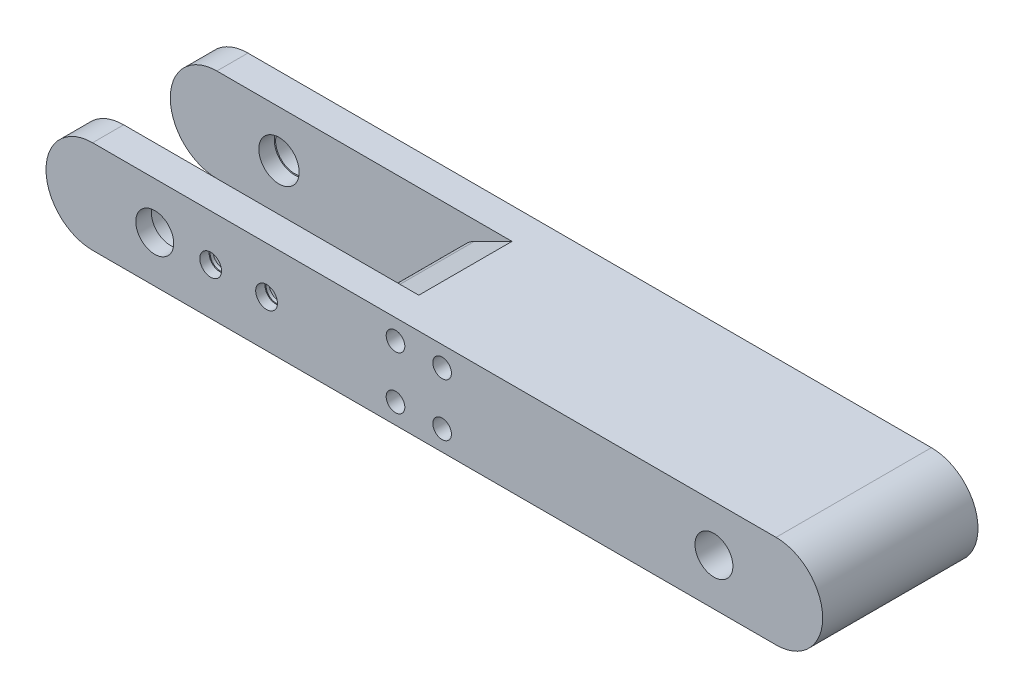
ISO-10303-21;
HEADER;
FILE_DESCRIPTION(('STEP AP214'),'2;1');
FILE_NAME('part.step','',(''),(''),'','','');
FILE_SCHEMA(('AUTOMOTIVE_DESIGN { 1 0 10303 214 1 1 1 1 }'));
ENDSEC;
DATA;
#1=APPLICATION_CONTEXT('core data for automotive mechanical design processes');
#2=APPLICATION_PROTOCOL_DEFINITION('international standard','automotive_design',2000,#1);
#3=PRODUCT_CONTEXT('',#1,'mechanical');
#4=PRODUCT('Part','Part','',(#3));
#5=PRODUCT_RELATED_PRODUCT_CATEGORY('part','',(#4));
#6=PRODUCT_DEFINITION_FORMATION('','',#4);
#7=PRODUCT_DEFINITION_CONTEXT('part definition',#1,'design');
#8=PRODUCT_DEFINITION('design','',#6,#7);
#9=PRODUCT_DEFINITION_SHAPE('','',#8);
#10=(LENGTH_UNIT() NAMED_UNIT(*) SI_UNIT(.MILLI.,.METRE.));
#11=(NAMED_UNIT(*) PLANE_ANGLE_UNIT() SI_UNIT($,.RADIAN.));
#12=(NAMED_UNIT(*) SI_UNIT($,.STERADIAN.) SOLID_ANGLE_UNIT());
#13=UNCERTAINTY_MEASURE_WITH_UNIT(LENGTH_MEASURE(1.E-05),#10,'distance_accuracy_value','');
#14=(GEOMETRIC_REPRESENTATION_CONTEXT(3) GLOBAL_UNCERTAINTY_ASSIGNED_CONTEXT((#13)) GLOBAL_UNIT_ASSIGNED_CONTEXT((#10,
#11,#12)) REPRESENTATION_CONTEXT('',''));
#15=CARTESIAN_POINT('',(0.,0.,0.));
#16=DIRECTION('',(0.,0.,1.));
#17=DIRECTION('',(1.,0.,0.));
#18=AXIS2_PLACEMENT_3D('',#15,#16,#17);
#19=CARTESIAN_POINT('',(-90.,0.,25.));
#20=DIRECTION('',(0.,0.,-1.));
#21=DIRECTION('',(-1.,0.,0.));
#22=AXIS2_PLACEMENT_3D('',#19,#20,#21);
#23=CYLINDRICAL_SURFACE('',#22,6.1);
#24=CARTESIAN_POINT('',(-90.,0.,-25.));
#25=DIRECTION('',(0.,0.,1.));
#26=DIRECTION('',(1.,0.,0.));
#27=AXIS2_PLACEMENT_3D('',#24,#25,#26);
#28=CIRCLE('',#27,6.1);
#29=CARTESIAN_POINT('',(-83.9,0.,-25.));
#30=VERTEX_POINT('',#29);
#31=EDGE_CURVE('E153',#30,#30,#28,.T.);
#32=ORIENTED_EDGE('',*,*,#31,.F.);
#33=EDGE_LOOP('',(#32));
#34=FACE_BOUND('',#33,.T.);
#35=CARTESIAN_POINT('',(-90.,0.,-20.));
#36=DIRECTION('',(0.,0.,1.));
#37=DIRECTION('',(1.,0.,0.));
#38=AXIS2_PLACEMENT_3D('',#35,#36,#37);
#39=CIRCLE('',#38,6.1);
#40=CARTESIAN_POINT('',(-83.9,0.,-20.));
#41=VERTEX_POINT('',#40);
#42=EDGE_CURVE('E37',#41,#41,#39,.T.);
#43=ORIENTED_EDGE('',*,*,#42,.T.);
#44=EDGE_LOOP('',(#43));
#45=FACE_BOUND('',#44,.T.);
#46=ADVANCED_FACE('F33',(#34,#45),#23,.F.);
#47=CARTESIAN_POINT('',(-90.,0.,25.));
#48=DIRECTION('',(0.,0.,1.));
#49=DIRECTION('',(1.,0.,0.));
#50=AXIS2_PLACEMENT_3D('',#47,#48,#49);
#51=CIRCLE('',#50,6.1);
#52=CARTESIAN_POINT('',(-83.9,0.,25.));
#53=VERTEX_POINT('',#52);
#54=EDGE_CURVE('E156',#53,#53,#51,.T.);
#55=ORIENTED_EDGE('',*,*,#54,.T.);
#56=EDGE_LOOP('',(#55));
#57=FACE_BOUND('',#56,.T.);
#58=CARTESIAN_POINT('',(-90.,0.,20.));
#59=DIRECTION('',(0.,0.,-1.));
#60=DIRECTION('',(-1.,0.,0.));
#61=AXIS2_PLACEMENT_3D('',#58,#59,#60);
#62=CIRCLE('',#61,6.1);
#63=CARTESIAN_POINT('',(-96.1,0.,20.));
#64=VERTEX_POINT('',#63);
#65=EDGE_CURVE('E206',#64,#64,#62,.T.);
#66=ORIENTED_EDGE('',*,*,#65,.T.);
#67=EDGE_LOOP('',(#66));
#68=FACE_BOUND('',#67,.T.);
#69=ADVANCED_FACE('F300',(#57,#68),#23,.F.);
#70=CARTESIAN_POINT('',(-110.,-15.,25.));
#71=DIRECTION('',(0.,1.,0.));
#72=DIRECTION('',(0.,0.,1.));
#73=AXIS2_PLACEMENT_3D('',#70,#71,#72);
#74=PLANE('',#73);
#75=DIRECTION('',(0.,0.,1.));
#76=VECTOR('',#75,1.);
#77=CARTESIAN_POINT('',(-15.,-15.,-15.));
#78=LINE('',#77,#76);
#79=CARTESIAN_POINT('',(-15.,-15.,-15.));
#80=VERTEX_POINT('',#79);
#81=CARTESIAN_POINT('',(-15.,-15.,15.));
#82=VERTEX_POINT('',#81);
#83=EDGE_CURVE('E112',#80,#82,#78,.T.);
#84=ORIENTED_EDGE('',*,*,#83,.F.);
#85=DIRECTION('',(-1.,0.,0.));
#86=VECTOR('',#85,1.);
#87=CARTESIAN_POINT('',(-110.,-15.,-15.));
#88=LINE('',#87,#86);
#89=CARTESIAN_POINT('',(-110.,-15.,-15.));
#90=VERTEX_POINT('',#89);
#91=EDGE_CURVE('E118',#80,#90,#88,.T.);
#92=ORIENTED_EDGE('',*,*,#91,.T.);
#93=DIRECTION('',(0.,0.,-1.));
#94=VECTOR('',#93,1.);
#95=CARTESIAN_POINT('',(-110.,-15.,25.));
#96=LINE('',#95,#94);
#97=CARTESIAN_POINT('',(-110.,-15.,-25.));
#98=VERTEX_POINT('',#97);
#99=EDGE_CURVE('E184',#90,#98,#96,.T.);
#100=ORIENTED_EDGE('',*,*,#99,.T.);
#101=DIRECTION('',(1.,0.,0.));
#102=VECTOR('',#101,1.);
#103=CARTESIAN_POINT('',(-110.,-15.,-25.));
#104=LINE('',#103,#102);
#105=CARTESIAN_POINT('',(110.,-15.,-25.));
#106=VERTEX_POINT('',#105);
#107=EDGE_CURVE('E166',#98,#106,#104,.T.);
#108=ORIENTED_EDGE('',*,*,#107,.T.);
#109=DIRECTION('',(0.,0.,-1.));
#110=VECTOR('',#109,1.);
#111=CARTESIAN_POINT('',(110.,-15.,25.));
#112=LINE('',#111,#110);
#113=CARTESIAN_POINT('',(110.,-15.,25.));
#114=VERTEX_POINT('',#113);
#115=EDGE_CURVE('E172',#114,#106,#112,.T.);
#116=ORIENTED_EDGE('',*,*,#115,.F.);
#117=DIRECTION('',(1.,0.,0.));
#118=VECTOR('',#117,1.);
#119=CARTESIAN_POINT('',(-110.,-15.,25.));
#120=LINE('',#119,#118);
#121=CARTESIAN_POINT('',(-110.,-15.,25.));
#122=VERTEX_POINT('',#121);
#123=EDGE_CURVE('E170',#122,#114,#120,.T.);
#124=ORIENTED_EDGE('',*,*,#123,.F.);
#125=CARTESIAN_POINT('',(-110.,-15.,15.));
#126=VERTEX_POINT('',#125);
#127=EDGE_CURVE('E185',#122,#126,#96,.T.);
#128=ORIENTED_EDGE('',*,*,#127,.T.);
#129=DIRECTION('',(1.,0.,0.));
#130=VECTOR('',#129,1.);
#131=CARTESIAN_POINT('',(-110.,-15.,15.));
#132=LINE('',#131,#130);
#133=EDGE_CURVE('E129',#126,#82,#132,.T.);
#134=ORIENTED_EDGE('',*,*,#133,.T.);
#135=EDGE_LOOP('',(#84,#92,#100,#108,#116,#124,#128,#134));
#136=FACE_BOUND('',#135,.T.);
#137=ADVANCED_FACE('F127',(#136),#74,.F.);
#138=CARTESIAN_POINT('',(-110.,0.,25.));
#139=DIRECTION('',(0.,0.,-1.));
#140=DIRECTION('',(-1.,0.,0.));
#141=AXIS2_PLACEMENT_3D('',#138,#139,#140);
#142=CYLINDRICAL_SURFACE('',#141,15.);
#143=DIRECTION('',(0.,0.,-1.));
#144=VECTOR('',#143,1.);
#145=CARTESIAN_POINT('',(-110.,15.,25.));
#146=LINE('',#145,#144);
#147=CARTESIAN_POINT('',(-110.,15.,25.));
#148=VERTEX_POINT('',#147);
#149=CARTESIAN_POINT('',(-110.,15.,15.));
#150=VERTEX_POINT('',#149);
#151=EDGE_CURVE('E188',#148,#150,#146,.T.);
#152=ORIENTED_EDGE('',*,*,#151,.T.);
#153=CARTESIAN_POINT('',(-110.,0.,15.));
#154=DIRECTION('',(0.,0.,1.));
#155=DIRECTION('',(1.,0.,0.));
#156=AXIS2_PLACEMENT_3D('',#153,#154,#155);
#157=CIRCLE('',#156,15.);
#158=EDGE_CURVE('E146',#150,#126,#157,.T.);
#159=ORIENTED_EDGE('',*,*,#158,.T.);
#160=ORIENTED_EDGE('',*,*,#127,.F.);
#161=CARTESIAN_POINT('',(-110.,0.,25.));
#162=DIRECTION('',(0.,0.,1.));
#163=DIRECTION('',(-1.,0.,0.));
#164=AXIS2_PLACEMENT_3D('',#161,#162,#163);
#165=CIRCLE('',#164,15.);
#166=EDGE_CURVE('E168',#148,#122,#165,.T.);
#167=ORIENTED_EDGE('',*,*,#166,.F.);
#168=EDGE_LOOP('',(#152,#159,#160,#167));
#169=FACE_BOUND('',#168,.T.);
#170=ADVANCED_FACE('F269',(#169),#142,.T.);
#171=CARTESIAN_POINT('',(110.,0.,25.));
#172=DIRECTION('',(0.,0.,1.));
#173=DIRECTION('',(1.,0.,0.));
#174=AXIS2_PLACEMENT_3D('',#171,#172,#173);
#175=PLANE('',#174);
#176=CARTESIAN_POINT('',(-72.,0.,25.));
#177=DIRECTION('',(0.,0.,1.));
#178=DIRECTION('',(1.,0.,0.));
#179=AXIS2_PLACEMENT_3D('',#176,#177,#178);
#180=CIRCLE('',#179,3.50000000000001);
#181=CARTESIAN_POINT('',(-68.5,0.,25.));
#182=VERTEX_POINT('',#181);
#183=EDGE_CURVE('E228',#182,#182,#180,.T.);
#184=ORIENTED_EDGE('',*,*,#183,.F.);
#185=EDGE_LOOP('',(#184));
#186=FACE_BOUND('',#185,.T.);
#187=CARTESIAN_POINT('',(-54.,0.,25.));
#188=DIRECTION('',(0.,0.,1.));
#189=DIRECTION('',(1.,0.,0.));
#190=AXIS2_PLACEMENT_3D('',#187,#188,#189);
#191=CIRCLE('',#190,3.5);
#192=CARTESIAN_POINT('',(-50.5,0.,25.));
#193=VERTEX_POINT('',#192);
#194=EDGE_CURVE('E208',#193,#193,#191,.T.);
#195=ORIENTED_EDGE('',*,*,#194,.F.);
#196=EDGE_LOOP('',(#195));
#197=FACE_BOUND('',#196,.T.);
#198=CARTESIAN_POINT('',(-12.5,8.5,25.));
#199=DIRECTION('',(0.,0.,1.));
#200=DIRECTION('',(1.,0.,0.));
#201=AXIS2_PLACEMENT_3D('',#198,#199,#200);
#202=CIRCLE('',#201,3.);
#203=CARTESIAN_POINT('',(-9.5,8.5,25.));
#204=VERTEX_POINT('',#203);
#205=EDGE_CURVE('E249',#204,#204,#202,.T.);
#206=ORIENTED_EDGE('',*,*,#205,.F.);
#207=EDGE_LOOP('',(#206));
#208=FACE_BOUND('',#207,.T.);
#209=CARTESIAN_POINT('',(2.5,-8.5,25.));
#210=DIRECTION('',(0.,0.,1.));
#211=DIRECTION('',(-1.,0.,0.));
#212=AXIS2_PLACEMENT_3D('',#209,#210,#211);
#213=CIRCLE('',#212,3.);
#214=CARTESIAN_POINT('',(-0.499999999999999,-8.5,25.));
#215=VERTEX_POINT('',#214);
#216=EDGE_CURVE('E242',#215,#215,#213,.T.);
#217=ORIENTED_EDGE('',*,*,#216,.F.);
#218=EDGE_LOOP('',(#217));
#219=FACE_BOUND('',#218,.T.);
#220=CARTESIAN_POINT('',(-12.5,-8.5,25.));
#221=DIRECTION('',(0.,0.,1.));
#222=DIRECTION('',(-1.,0.,0.));
#223=AXIS2_PLACEMENT_3D('',#220,#221,#222);
#224=CIRCLE('',#223,3.);
#225=CARTESIAN_POINT('',(-15.5,-8.5,25.));
#226=VERTEX_POINT('',#225);
#227=EDGE_CURVE('E236',#226,#226,#224,.T.);
#228=ORIENTED_EDGE('',*,*,#227,.F.);
#229=EDGE_LOOP('',(#228));
#230=FACE_BOUND('',#229,.T.);
#231=CARTESIAN_POINT('',(2.5,8.5,25.));
#232=DIRECTION('',(0.,0.,1.));
#233=DIRECTION('',(1.,0.,0.));
#234=AXIS2_PLACEMENT_3D('',#231,#232,#233);
#235=CIRCLE('',#234,3.);
#236=CARTESIAN_POINT('',(5.5,8.5,25.));
#237=VERTEX_POINT('',#236);
#238=EDGE_CURVE('E248',#237,#237,#235,.T.);
#239=ORIENTED_EDGE('',*,*,#238,.F.);
#240=EDGE_LOOP('',(#239));
#241=FACE_BOUND('',#240,.T.);
#242=ORIENTED_EDGE('',*,*,#54,.F.);
#243=EDGE_LOOP('',(#242));
#244=FACE_BOUND('',#243,.T.);
#245=CARTESIAN_POINT('',(110.,0.,25.));
#246=DIRECTION('',(0.,0.,1.));
#247=DIRECTION('',(1.,0.,0.));
#248=AXIS2_PLACEMENT_3D('',#245,#246,#247);
#249=CIRCLE('',#248,15.);
#250=CARTESIAN_POINT('',(110.,15.,25.));
#251=VERTEX_POINT('',#250);
#252=EDGE_CURVE('E162',#114,#251,#249,.T.);
#253=ORIENTED_EDGE('',*,*,#252,.T.);
#254=DIRECTION('',(-1.,0.,0.));
#255=VECTOR('',#254,1.);
#256=CARTESIAN_POINT('',(-110.,15.,25.));
#257=LINE('',#256,#255);
#258=EDGE_CURVE('E165',#251,#148,#257,.T.);
#259=ORIENTED_EDGE('',*,*,#258,.T.);
#260=ORIENTED_EDGE('',*,*,#166,.T.);
#261=ORIENTED_EDGE('',*,*,#123,.T.);
#262=EDGE_LOOP('',(#253,#259,#260,#261));
#263=FACE_BOUND('',#262,.T.);
#264=CARTESIAN_POINT('',(90.,0.,25.));
#265=DIRECTION('',(0.,0.,1.));
#266=DIRECTION('',(1.,0.,0.));
#267=AXIS2_PLACEMENT_3D('',#264,#265,#266);
#268=CIRCLE('',#267,6.1);
#269=CARTESIAN_POINT('',(96.1,0.,25.));
#270=VERTEX_POINT('',#269);
#271=EDGE_CURVE('E150',#270,#270,#268,.T.);
#272=ORIENTED_EDGE('',*,*,#271,.F.);
#273=EDGE_LOOP('',(#272));
#274=FACE_BOUND('',#273,.T.);
#275=ADVANCED_FACE('F265',(#186,#197,#208,#219,#230,#241,#244,#263,#274),#175,.T.);
#276=CARTESIAN_POINT('',(110.,0.,-25.));
#277=DIRECTION('',(0.,0.,1.));
#278=DIRECTION('',(1.,0.,0.));
#279=AXIS2_PLACEMENT_3D('',#276,#277,#278);
#280=PLANE('',#279);
#281=CARTESIAN_POINT('',(110.,0.,-25.));
#282=DIRECTION('',(0.,0.,1.));
#283=DIRECTION('',(1.,0.,0.));
#284=AXIS2_PLACEMENT_3D('',#281,#282,#283);
#285=CIRCLE('',#284,15.);
#286=CARTESIAN_POINT('',(110.,15.,-25.));
#287=VERTEX_POINT('',#286);
#288=EDGE_CURVE('E159',#106,#287,#285,.T.);
#289=ORIENTED_EDGE('',*,*,#288,.F.);
#290=ORIENTED_EDGE('',*,*,#107,.F.);
#291=CARTESIAN_POINT('',(-110.,0.,-25.));
#292=DIRECTION('',(0.,0.,1.));
#293=DIRECTION('',(-1.,0.,0.));
#294=AXIS2_PLACEMENT_3D('',#291,#292,#293);
#295=CIRCLE('',#294,15.);
#296=CARTESIAN_POINT('',(-110.,15.,-25.));
#297=VERTEX_POINT('',#296);
#298=EDGE_CURVE('E178',#297,#98,#295,.T.);
#299=ORIENTED_EDGE('',*,*,#298,.F.);
#300=DIRECTION('',(-1.,0.,0.));
#301=VECTOR('',#300,1.);
#302=CARTESIAN_POINT('',(-110.,15.,-25.));
#303=LINE('',#302,#301);
#304=EDGE_CURVE('E175',#287,#297,#303,.T.);
#305=ORIENTED_EDGE('',*,*,#304,.F.);
#306=EDGE_LOOP('',(#289,#290,#299,#305));
#307=FACE_BOUND('',#306,.T.);
#308=ORIENTED_EDGE('',*,*,#31,.T.);
#309=EDGE_LOOP('',(#308));
#310=FACE_BOUND('',#309,.T.);
#311=CARTESIAN_POINT('',(90.,0.,-25.));
#312=DIRECTION('',(0.,0.,1.));
#313=DIRECTION('',(1.,0.,0.));
#314=AXIS2_PLACEMENT_3D('',#311,#312,#313);
#315=CIRCLE('',#314,6.1);
#316=CARTESIAN_POINT('',(96.1,0.,-25.));
#317=VERTEX_POINT('',#316);
#318=EDGE_CURVE('E149',#317,#317,#315,.T.);
#319=ORIENTED_EDGE('',*,*,#318,.T.);
#320=EDGE_LOOP('',(#319));
#321=FACE_BOUND('',#320,.T.);
#322=ADVANCED_FACE('F268',(#307,#310,#321),#280,.F.);
#323=CARTESIAN_POINT('',(110.,0.,25.));
#324=DIRECTION('',(0.,0.,-1.));
#325=DIRECTION('',(-1.,0.,0.));
#326=AXIS2_PLACEMENT_3D('',#323,#324,#325);
#327=CYLINDRICAL_SURFACE('',#326,15.);
#328=ORIENTED_EDGE('',*,*,#288,.T.);
#329=DIRECTION('',(0.,0.,-1.));
#330=VECTOR('',#329,1.);
#331=CARTESIAN_POINT('',(110.,15.,25.));
#332=LINE('',#331,#330);
#333=EDGE_CURVE('E191',#251,#287,#332,.T.);
#334=ORIENTED_EDGE('',*,*,#333,.F.);
#335=ORIENTED_EDGE('',*,*,#252,.F.);
#336=ORIENTED_EDGE('',*,*,#115,.T.);
#337=EDGE_LOOP('',(#328,#334,#335,#336));
#338=FACE_BOUND('',#337,.T.);
#339=ADVANCED_FACE('F288',(#338),#327,.T.);
#340=CARTESIAN_POINT('',(-110.,15.,25.));
#341=DIRECTION('',(0.,-1.,0.));
#342=DIRECTION('',(0.,0.,-1.));
#343=AXIS2_PLACEMENT_3D('',#340,#341,#342);
#344=PLANE('',#343);
#345=DIRECTION('',(-1.,0.,0.));
#346=VECTOR('',#345,1.);
#347=CARTESIAN_POINT('',(-205.,15.,-15.));
#348=LINE('',#347,#346);
#349=CARTESIAN_POINT('',(-15.,15.,-15.));
#350=VERTEX_POINT('',#349);
#351=CARTESIAN_POINT('',(-110.,15.,-15.));
#352=VERTEX_POINT('',#351);
#353=EDGE_CURVE('E140',#350,#352,#348,.T.);
#354=ORIENTED_EDGE('',*,*,#353,.F.);
#355=DIRECTION('',(0.,0.,1.));
#356=VECTOR('',#355,1.);
#357=CARTESIAN_POINT('',(-15.,15.,-15.));
#358=LINE('',#357,#356);
#359=CARTESIAN_POINT('',(-15.,15.,15.));
#360=VERTEX_POINT('',#359);
#361=EDGE_CURVE('E136',#350,#360,#358,.T.);
#362=ORIENTED_EDGE('',*,*,#361,.T.);
#363=DIRECTION('',(1.,0.,0.));
#364=VECTOR('',#363,1.);
#365=CARTESIAN_POINT('',(-205.,15.,15.));
#366=LINE('',#365,#364);
#367=EDGE_CURVE('E124',#150,#360,#366,.T.);
#368=ORIENTED_EDGE('',*,*,#367,.F.);
#369=ORIENTED_EDGE('',*,*,#151,.F.);
#370=ORIENTED_EDGE('',*,*,#258,.F.);
#371=ORIENTED_EDGE('',*,*,#333,.T.);
#372=ORIENTED_EDGE('',*,*,#304,.T.);
#373=EDGE_CURVE('E187',#352,#297,#146,.T.);
#374=ORIENTED_EDGE('',*,*,#373,.F.);
#375=EDGE_LOOP('',(#354,#362,#368,#369,#370,#371,#372,#374));
#376=FACE_BOUND('',#375,.T.);
#377=ADVANCED_FACE('F294',(#376),#344,.F.);
#378=ORIENTED_EDGE('',*,*,#99,.F.);
#379=CARTESIAN_POINT('',(-110.,0.,-15.));
#380=DIRECTION('',(0.,0.,-1.));
#381=DIRECTION('',(-1.,0.,0.));
#382=AXIS2_PLACEMENT_3D('',#379,#380,#381);
#383=CIRCLE('',#382,15.);
#384=EDGE_CURVE('E121',#90,#352,#383,.T.);
#385=ORIENTED_EDGE('',*,*,#384,.T.);
#386=ORIENTED_EDGE('',*,*,#373,.T.);
#387=ORIENTED_EDGE('',*,*,#298,.T.);
#388=EDGE_LOOP('',(#378,#385,#386,#387));
#389=FACE_BOUND('',#388,.T.);
#390=ADVANCED_FACE('F283',(#389),#142,.T.);
#391=CARTESIAN_POINT('',(90.,0.,25.));
#392=DIRECTION('',(0.,0.,-1.));
#393=DIRECTION('',(-1.,0.,0.));
#394=AXIS2_PLACEMENT_3D('',#391,#392,#393);
#395=CYLINDRICAL_SURFACE('',#394,6.1);
#396=ORIENTED_EDGE('',*,*,#271,.T.);
#397=EDGE_LOOP('',(#396));
#398=FACE_BOUND('',#397,.T.);
#399=ORIENTED_EDGE('',*,*,#318,.F.);
#400=EDGE_LOOP('',(#399));
#401=FACE_BOUND('',#400,.T.);
#402=ADVANCED_FACE('F279',(#398,#401),#395,.F.);
#403=CARTESIAN_POINT('',(-205.,-35.,15.));
#404=DIRECTION('',(0.,0.,1.));
#405=DIRECTION('',(1.,0.,0.));
#406=AXIS2_PLACEMENT_3D('',#403,#404,#405);
#407=PLANE('',#406);
#408=CARTESIAN_POINT('',(-90.,0.,15.));
#409=DIRECTION('',(0.,0.,-1.));
#410=DIRECTION('',(-1.,0.,0.));
#411=AXIS2_PLACEMENT_3D('',#408,#409,#410);
#412=CIRCLE('',#411,6.5);
#413=CARTESIAN_POINT('',(-96.5,0.,15.));
#414=VERTEX_POINT('',#413);
#415=EDGE_CURVE('E216',#414,#414,#412,.T.);
#416=ORIENTED_EDGE('',*,*,#415,.F.);
#417=EDGE_LOOP('',(#416));
#418=FACE_BOUND('',#417,.T.);
#419=ORIENTED_EDGE('',*,*,#367,.T.);
#420=DIRECTION('',(0.894427190999916,0.447213595499958,0.));
#421=VECTOR('',#420,1.);
#422=CARTESIAN_POINT('',(-45.,0.,15.));
#423=LINE('',#422,#421);
#424=CARTESIAN_POINT('',(-27.1114561800017,8.94427190999916,15.));
#425=VERTEX_POINT('',#424);
#426=EDGE_CURVE('E130',#425,#360,#423,.T.);
#427=ORIENTED_EDGE('',*,*,#426,.F.);
#428=CARTESIAN_POINT('',(-22.6393202250021,0.,15.));
#429=DIRECTION('',(0.,0.,1.));
#430=DIRECTION('',(1.,0.,0.));
#431=AXIS2_PLACEMENT_3D('',#428,#429,#430);
#432=CIRCLE('',#431,10.);
#433=CARTESIAN_POINT('',(-27.1114561800017,-8.94427190999916,15.));
#434=VERTEX_POINT('',#433);
#435=EDGE_CURVE('E42',#425,#434,#432,.T.);
#436=ORIENTED_EDGE('',*,*,#435,.T.);
#437=DIRECTION('',(0.894427190999916,-0.447213595499958,0.));
#438=VECTOR('',#437,1.);
#439=CARTESIAN_POINT('',(-15.,-15.,15.));
#440=LINE('',#439,#438);
#441=EDGE_CURVE('E115',#434,#82,#440,.T.);
#442=ORIENTED_EDGE('',*,*,#441,.T.);
#443=ORIENTED_EDGE('',*,*,#133,.F.);
#444=ORIENTED_EDGE('',*,*,#158,.F.);
#445=EDGE_LOOP('',(#419,#427,#436,#442,#443,#444));
#446=FACE_BOUND('',#445,.T.);
#447=ADVANCED_FACE('F282',(#418,#446),#407,.F.);
#448=CARTESIAN_POINT('',(-205.,-35.,-15.));
#449=DIRECTION('',(0.,0.,-1.));
#450=DIRECTION('',(-1.,0.,0.));
#451=AXIS2_PLACEMENT_3D('',#448,#449,#450);
#452=PLANE('',#451);
#453=CARTESIAN_POINT('',(-90.,0.,-15.));
#454=DIRECTION('',(0.,0.,1.));
#455=DIRECTION('',(1.,0.,0.));
#456=AXIS2_PLACEMENT_3D('',#453,#454,#455);
#457=CIRCLE('',#456,6.5);
#458=CARTESIAN_POINT('',(-83.5,0.,-15.));
#459=VERTEX_POINT('',#458);
#460=EDGE_CURVE('E223',#459,#459,#457,.T.);
#461=ORIENTED_EDGE('',*,*,#460,.F.);
#462=EDGE_LOOP('',(#461));
#463=FACE_BOUND('',#462,.T.);
#464=ORIENTED_EDGE('',*,*,#91,.F.);
#465=DIRECTION('',(0.894427190999916,-0.447213595499958,0.));
#466=VECTOR('',#465,1.);
#467=CARTESIAN_POINT('',(-15.,-15.,-15.));
#468=LINE('',#467,#466);
#469=CARTESIAN_POINT('',(-27.1114561800017,-8.94427190999916,-15.));
#470=VERTEX_POINT('',#469);
#471=EDGE_CURVE('E108',#470,#80,#468,.T.);
#472=ORIENTED_EDGE('',*,*,#471,.F.);
#473=CARTESIAN_POINT('',(-22.6393202250021,0.,-15.));
#474=DIRECTION('',(0.,0.,-1.));
#475=DIRECTION('',(-1.,0.,0.));
#476=AXIS2_PLACEMENT_3D('',#473,#474,#475);
#477=CIRCLE('',#476,10.);
#478=CARTESIAN_POINT('',(-27.1114561800017,8.94427190999916,-15.));
#479=VERTEX_POINT('',#478);
#480=EDGE_CURVE('E11',#470,#479,#477,.T.);
#481=ORIENTED_EDGE('',*,*,#480,.T.);
#482=DIRECTION('',(0.894427190999916,0.447213595499958,0.));
#483=VECTOR('',#482,1.);
#484=CARTESIAN_POINT('',(-45.,0.,-15.));
#485=LINE('',#484,#483);
#486=EDGE_CURVE('E132',#479,#350,#485,.T.);
#487=ORIENTED_EDGE('',*,*,#486,.T.);
#488=ORIENTED_EDGE('',*,*,#353,.T.);
#489=ORIENTED_EDGE('',*,*,#384,.F.);
#490=EDGE_LOOP('',(#464,#472,#481,#487,#488,#489));
#491=FACE_BOUND('',#490,.T.);
#492=ADVANCED_FACE('F119',(#463,#491),#452,.F.);
#493=CARTESIAN_POINT('',(-45.,0.,-15.));
#494=DIRECTION('',(0.447213595499958,-0.894427190999916,0.));
#495=DIRECTION('',(0.894427190999916,0.447213595499958,0.));
#496=AXIS2_PLACEMENT_3D('',#493,#494,#495);
#497=PLANE('',#496);
#498=ORIENTED_EDGE('',*,*,#486,.F.);
#499=DIRECTION('',(0.,0.,1.));
#500=VECTOR('',#499,1.);
#501=CARTESIAN_POINT('',(-27.1114561800017,8.94427190999916,15.));
#502=LINE('',#501,#500);
#503=EDGE_CURVE('E194',#479,#425,#502,.T.);
#504=ORIENTED_EDGE('',*,*,#503,.T.);
#505=ORIENTED_EDGE('',*,*,#426,.T.);
#506=ORIENTED_EDGE('',*,*,#361,.F.);
#507=EDGE_LOOP('',(#498,#504,#505,#506));
#508=FACE_BOUND('',#507,.T.);
#509=ADVANCED_FACE('F312',(#508),#497,.F.);
#510=CARTESIAN_POINT('',(-15.,-15.,-15.));
#511=DIRECTION('',(-0.447213595499958,-0.894427190999916,0.));
#512=DIRECTION('',(0.894427190999916,-0.447213595499958,0.));
#513=AXIS2_PLACEMENT_3D('',#510,#511,#512);
#514=PLANE('',#513);
#515=ORIENTED_EDGE('',*,*,#441,.F.);
#516=DIRECTION('',(0.,0.,1.));
#517=VECTOR('',#516,1.);
#518=CARTESIAN_POINT('',(-27.1114561800017,-8.94427190999916,-15.));
#519=LINE('',#518,#517);
#520=EDGE_CURVE('E50',#434,#470,#519,.F.);
#521=ORIENTED_EDGE('',*,*,#520,.T.);
#522=ORIENTED_EDGE('',*,*,#471,.T.);
#523=ORIENTED_EDGE('',*,*,#83,.T.);
#524=EDGE_LOOP('',(#515,#521,#522,#523));
#525=FACE_BOUND('',#524,.T.);
#526=ADVANCED_FACE('F110',(#525),#514,.T.);
#527=CARTESIAN_POINT('',(-22.6393202250021,0.,-15.));
#528=DIRECTION('',(0.,0.,-1.));
#529=DIRECTION('',(-1.,0.,0.));
#530=AXIS2_PLACEMENT_3D('',#527,#528,#529);
#531=CYLINDRICAL_SURFACE('',#530,10.);
#532=ORIENTED_EDGE('',*,*,#480,.F.);
#533=ORIENTED_EDGE('',*,*,#520,.F.);
#534=ORIENTED_EDGE('',*,*,#435,.F.);
#535=ORIENTED_EDGE('',*,*,#503,.F.);
#536=EDGE_LOOP('',(#532,#533,#534,#535));
#537=FACE_BOUND('',#536,.T.);
#538=ADVANCED_FACE('F35',(#537),#531,.T.);
#539=CARTESIAN_POINT('',(2.5,8.5,5.));
#540=DIRECTION('',(0.,0.,1.));
#541=DIRECTION('',(1.,0.,0.));
#542=AXIS2_PLACEMENT_3D('',#539,#540,#541);
#543=CYLINDRICAL_SURFACE('',#542,3.);
#544=CARTESIAN_POINT('',(2.5,8.5,5.));
#545=DIRECTION('',(0.,0.,1.));
#546=DIRECTION('',(1.,0.,0.));
#547=AXIS2_PLACEMENT_3D('',#544,#545,#546);
#548=CIRCLE('',#547,3.);
#549=CARTESIAN_POINT('',(5.5,8.5,5.));
#550=VERTEX_POINT('',#549);
#551=EDGE_CURVE('E257',#550,#550,#548,.T.);
#552=ORIENTED_EDGE('',*,*,#551,.F.);
#553=EDGE_LOOP('',(#552));
#554=FACE_BOUND('',#553,.T.);
#555=ORIENTED_EDGE('',*,*,#238,.T.);
#556=EDGE_LOOP('',(#555));
#557=FACE_BOUND('',#556,.T.);
#558=ADVANCED_FACE('F263',(#554,#557),#543,.F.);
#559=CARTESIAN_POINT('',(2.5,8.5,5.));
#560=DIRECTION('',(0.,0.,1.));
#561=DIRECTION('',(1.,0.,0.));
#562=AXIS2_PLACEMENT_3D('',#559,#560,#561);
#563=PLANE('',#562);
#564=ORIENTED_EDGE('',*,*,#551,.T.);
#565=EDGE_LOOP('',(#564));
#566=FACE_BOUND('',#565,.T.);
#567=ADVANCED_FACE('F324',(#566),#563,.T.);
#568=CARTESIAN_POINT('',(-12.5,-8.5,5.));
#569=DIRECTION('',(0.,0.,1.));
#570=DIRECTION('',(1.,0.,0.));
#571=AXIS2_PLACEMENT_3D('',#568,#569,#570);
#572=CYLINDRICAL_SURFACE('',#571,3.);
#573=CARTESIAN_POINT('',(-12.5,-8.5,5.));
#574=DIRECTION('',(0.,0.,1.));
#575=DIRECTION('',(-1.,0.,0.));
#576=AXIS2_PLACEMENT_3D('',#573,#574,#575);
#577=CIRCLE('',#576,3.);
#578=CARTESIAN_POINT('',(-15.5,-8.5,5.));
#579=VERTEX_POINT('',#578);
#580=EDGE_CURVE('E239',#579,#579,#577,.T.);
#581=ORIENTED_EDGE('',*,*,#580,.F.);
#582=EDGE_LOOP('',(#581));
#583=FACE_BOUND('',#582,.T.);
#584=ORIENTED_EDGE('',*,*,#227,.T.);
#585=EDGE_LOOP('',(#584));
#586=FACE_BOUND('',#585,.T.);
#587=ADVANCED_FACE('F328',(#583,#586),#572,.F.);
#588=CARTESIAN_POINT('',(-12.5,-8.5,5.));
#589=DIRECTION('',(0.,0.,-1.));
#590=DIRECTION('',(-1.,0.,0.));
#591=AXIS2_PLACEMENT_3D('',#588,#589,#590);
#592=PLANE('',#591);
#593=ORIENTED_EDGE('',*,*,#580,.T.);
#594=EDGE_LOOP('',(#593));
#595=FACE_BOUND('',#594,.T.);
#596=ADVANCED_FACE('F334',(#595),#592,.F.);
#597=CARTESIAN_POINT('',(2.5,-8.5,5.));
#598=DIRECTION('',(0.,0.,1.));
#599=DIRECTION('',(1.,0.,0.));
#600=AXIS2_PLACEMENT_3D('',#597,#598,#599);
#601=CYLINDRICAL_SURFACE('',#600,3.);
#602=CARTESIAN_POINT('',(2.5,-8.5,5.));
#603=DIRECTION('',(0.,0.,1.));
#604=DIRECTION('',(-1.,0.,0.));
#605=AXIS2_PLACEMENT_3D('',#602,#603,#604);
#606=CIRCLE('',#605,3.);
#607=CARTESIAN_POINT('',(-0.499999999999999,-8.5,5.));
#608=VERTEX_POINT('',#607);
#609=EDGE_CURVE('E252',#608,#608,#606,.T.);
#610=ORIENTED_EDGE('',*,*,#609,.F.);
#611=EDGE_LOOP('',(#610));
#612=FACE_BOUND('',#611,.T.);
#613=ORIENTED_EDGE('',*,*,#216,.T.);
#614=EDGE_LOOP('',(#613));
#615=FACE_BOUND('',#614,.T.);
#616=ADVANCED_FACE('F330',(#612,#615),#601,.F.);
#617=CARTESIAN_POINT('',(2.5,-8.5,5.));
#618=DIRECTION('',(0.,0.,-1.));
#619=DIRECTION('',(-1.,0.,0.));
#620=AXIS2_PLACEMENT_3D('',#617,#618,#619);
#621=PLANE('',#620);
#622=ORIENTED_EDGE('',*,*,#609,.T.);
#623=EDGE_LOOP('',(#622));
#624=FACE_BOUND('',#623,.T.);
#625=ADVANCED_FACE('F333',(#624),#621,.F.);
#626=CARTESIAN_POINT('',(-12.5,8.5,5.));
#627=DIRECTION('',(0.,0.,1.));
#628=DIRECTION('',(1.,0.,0.));
#629=AXIS2_PLACEMENT_3D('',#626,#627,#628);
#630=CYLINDRICAL_SURFACE('',#629,3.);
#631=CARTESIAN_POINT('',(-12.5,8.5,5.));
#632=DIRECTION('',(0.,0.,1.));
#633=DIRECTION('',(1.,0.,0.));
#634=AXIS2_PLACEMENT_3D('',#631,#632,#633);
#635=CIRCLE('',#634,3.);
#636=CARTESIAN_POINT('',(-9.5,8.5,5.));
#637=VERTEX_POINT('',#636);
#638=EDGE_CURVE('E245',#637,#637,#635,.T.);
#639=ORIENTED_EDGE('',*,*,#638,.F.);
#640=EDGE_LOOP('',(#639));
#641=FACE_BOUND('',#640,.T.);
#642=ORIENTED_EDGE('',*,*,#205,.T.);
#643=EDGE_LOOP('',(#642));
#644=FACE_BOUND('',#643,.T.);
#645=ADVANCED_FACE('F338',(#641,#644),#630,.F.);
#646=CARTESIAN_POINT('',(-12.5,8.5,5.));
#647=DIRECTION('',(0.,0.,1.));
#648=DIRECTION('',(1.,0.,0.));
#649=AXIS2_PLACEMENT_3D('',#646,#647,#648);
#650=PLANE('',#649);
#651=ORIENTED_EDGE('',*,*,#638,.T.);
#652=EDGE_LOOP('',(#651));
#653=FACE_BOUND('',#652,.T.);
#654=ADVANCED_FACE('F342',(#653),#650,.T.);
#655=CARTESIAN_POINT('',(-72.,0.,22.));
#656=DIRECTION('',(0.,0.,1.));
#657=DIRECTION('',(1.,0.,0.));
#658=AXIS2_PLACEMENT_3D('',#655,#656,#657);
#659=PLANE('',#658);
#660=CARTESIAN_POINT('',(-72.,0.,22.));
#661=DIRECTION('',(0.,0.,1.));
#662=DIRECTION('',(1.,0.,0.));
#663=AXIS2_PLACEMENT_3D('',#660,#661,#662);
#664=CIRCLE('',#663,3.50000000000001);
#665=CARTESIAN_POINT('',(-68.5,0.,22.));
#666=VERTEX_POINT('',#665);
#667=EDGE_CURVE('E203',#666,#666,#664,.T.);
#668=ORIENTED_EDGE('',*,*,#667,.T.);
#669=EDGE_LOOP('',(#668));
#670=FACE_BOUND('',#669,.T.);
#671=CARTESIAN_POINT('',(-72.,0.,22.));
#672=DIRECTION('',(0.,0.,1.));
#673=DIRECTION('',(1.,0.,0.));
#674=AXIS2_PLACEMENT_3D('',#671,#672,#673);
#675=CIRCLE('',#674,3.15);
#676=CARTESIAN_POINT('',(-68.85,0.,22.));
#677=VERTEX_POINT('',#676);
#678=EDGE_CURVE('E199',#677,#677,#675,.F.);
#679=ORIENTED_EDGE('',*,*,#678,.T.);
#680=EDGE_LOOP('',(#679));
#681=FACE_BOUND('',#680,.T.);
#682=ADVANCED_FACE('F346',(#670,#681),#659,.T.);
#683=CARTESIAN_POINT('',(-72.,0.,22.));
#684=DIRECTION('',(0.,0.,1.));
#685=DIRECTION('',(1.,0.,0.));
#686=AXIS2_PLACEMENT_3D('',#683,#684,#685);
#687=CYLINDRICAL_SURFACE('',#686,3.50000000000001);
#688=ORIENTED_EDGE('',*,*,#667,.F.);
#689=EDGE_LOOP('',(#688));
#690=FACE_BOUND('',#689,.T.);
#691=ORIENTED_EDGE('',*,*,#183,.T.);
#692=EDGE_LOOP('',(#691));
#693=FACE_BOUND('',#692,.T.);
#694=ADVANCED_FACE('F378',(#690,#693),#687,.F.);
#695=CARTESIAN_POINT('',(-54.,0.,22.));
#696=DIRECTION('',(0.,0.,1.));
#697=DIRECTION('',(1.,0.,0.));
#698=AXIS2_PLACEMENT_3D('',#695,#696,#697);
#699=PLANE('',#698);
#700=CARTESIAN_POINT('',(-54.,0.,22.));
#701=DIRECTION('',(0.,0.,1.));
#702=DIRECTION('',(1.,0.,0.));
#703=AXIS2_PLACEMENT_3D('',#700,#701,#702);
#704=CIRCLE('',#703,3.5);
#705=CARTESIAN_POINT('',(-50.5,0.,22.));
#706=VERTEX_POINT('',#705);
#707=EDGE_CURVE('E213',#706,#706,#704,.T.);
#708=ORIENTED_EDGE('',*,*,#707,.T.);
#709=EDGE_LOOP('',(#708));
#710=FACE_BOUND('',#709,.T.);
#711=CARTESIAN_POINT('',(-54.,0.,22.));
#712=DIRECTION('',(0.,0.,1.));
#713=DIRECTION('',(1.,0.,0.));
#714=AXIS2_PLACEMENT_3D('',#711,#712,#713);
#715=CIRCLE('',#714,3.15);
#716=CARTESIAN_POINT('',(-50.85,0.,22.));
#717=VERTEX_POINT('',#716);
#718=EDGE_CURVE('E202',#717,#717,#715,.F.);
#719=ORIENTED_EDGE('',*,*,#718,.T.);
#720=EDGE_LOOP('',(#719));
#721=FACE_BOUND('',#720,.T.);
#722=ADVANCED_FACE('F374',(#710,#721),#699,.T.);
#723=CARTESIAN_POINT('',(-54.,0.,22.));
#724=DIRECTION('',(0.,0.,1.));
#725=DIRECTION('',(1.,0.,0.));
#726=AXIS2_PLACEMENT_3D('',#723,#724,#725);
#727=CYLINDRICAL_SURFACE('',#726,3.5);
#728=ORIENTED_EDGE('',*,*,#707,.F.);
#729=EDGE_LOOP('',(#728));
#730=FACE_BOUND('',#729,.T.);
#731=ORIENTED_EDGE('',*,*,#194,.T.);
#732=EDGE_LOOP('',(#731));
#733=FACE_BOUND('',#732,.T.);
#734=ADVANCED_FACE('F370',(#730,#733),#727,.F.);
#735=CARTESIAN_POINT('',(-72.,0.,21.));
#736=DIRECTION('',(0.,0.,1.));
#737=DIRECTION('',(1.,0.,0.));
#738=AXIS2_PLACEMENT_3D('',#735,#736,#737);
#739=PLANE('',#738);
#740=CARTESIAN_POINT('',(-72.,0.,21.));
#741=DIRECTION('',(0.,0.,1.));
#742=DIRECTION('',(1.,0.,0.));
#743=AXIS2_PLACEMENT_3D('',#740,#741,#742);
#744=CIRCLE('',#743,3.15);
#745=CARTESIAN_POINT('',(-68.85,0.,21.));
#746=VERTEX_POINT('',#745);
#747=EDGE_CURVE('E233',#746,#746,#744,.T.);
#748=ORIENTED_EDGE('',*,*,#747,.T.);
#749=EDGE_LOOP('',(#748));
#750=FACE_BOUND('',#749,.T.);
#751=ADVANCED_FACE('F366',(#750),#739,.T.);
#752=CARTESIAN_POINT('',(-72.,0.,21.));
#753=DIRECTION('',(0.,0.,1.));
#754=DIRECTION('',(1.,0.,0.));
#755=AXIS2_PLACEMENT_3D('',#752,#753,#754);
#756=CYLINDRICAL_SURFACE('',#755,3.15);
#757=ORIENTED_EDGE('',*,*,#747,.F.);
#758=EDGE_LOOP('',(#757));
#759=FACE_BOUND('',#758,.T.);
#760=ORIENTED_EDGE('',*,*,#678,.F.);
#761=EDGE_LOOP('',(#760));
#762=FACE_BOUND('',#761,.T.);
#763=ADVANCED_FACE('F362',(#759,#762),#756,.F.);
#764=CARTESIAN_POINT('',(-54.,0.,21.));
#765=DIRECTION('',(0.,0.,1.));
#766=DIRECTION('',(1.,0.,0.));
#767=AXIS2_PLACEMENT_3D('',#764,#765,#766);
#768=PLANE('',#767);
#769=CARTESIAN_POINT('',(-54.,0.,21.));
#770=DIRECTION('',(0.,0.,1.));
#771=DIRECTION('',(1.,0.,0.));
#772=AXIS2_PLACEMENT_3D('',#769,#770,#771);
#773=CIRCLE('',#772,3.15);
#774=CARTESIAN_POINT('',(-50.85,0.,21.));
#775=VERTEX_POINT('',#774);
#776=EDGE_CURVE('E205',#775,#775,#773,.T.);
#777=ORIENTED_EDGE('',*,*,#776,.T.);
#778=EDGE_LOOP('',(#777));
#779=FACE_BOUND('',#778,.T.);
#780=ADVANCED_FACE('F358',(#779),#768,.T.);
#781=CARTESIAN_POINT('',(-54.,0.,21.));
#782=DIRECTION('',(0.,0.,1.));
#783=DIRECTION('',(1.,0.,0.));
#784=AXIS2_PLACEMENT_3D('',#781,#782,#783);
#785=CYLINDRICAL_SURFACE('',#784,3.15);
#786=ORIENTED_EDGE('',*,*,#776,.F.);
#787=EDGE_LOOP('',(#786));
#788=FACE_BOUND('',#787,.T.);
#789=ORIENTED_EDGE('',*,*,#718,.F.);
#790=EDGE_LOOP('',(#789));
#791=FACE_BOUND('',#790,.T.);
#792=ADVANCED_FACE('F354',(#788,#791),#785,.F.);
#793=CARTESIAN_POINT('',(-90.,0.,20.));
#794=DIRECTION('',(0.,0.,-1.));
#795=DIRECTION('',(-1.,0.,0.));
#796=AXIS2_PLACEMENT_3D('',#793,#794,#795);
#797=CYLINDRICAL_SURFACE('',#796,6.5);
#798=CARTESIAN_POINT('',(-90.,0.,20.));
#799=DIRECTION('',(0.,0.,-1.));
#800=DIRECTION('',(-1.,0.,0.));
#801=AXIS2_PLACEMENT_3D('',#798,#799,#800);
#802=CIRCLE('',#801,6.5);
#803=CARTESIAN_POINT('',(-96.5,0.,20.));
#804=VERTEX_POINT('',#803);
#805=EDGE_CURVE('E209',#804,#804,#802,.T.);
#806=ORIENTED_EDGE('',*,*,#805,.F.);
#807=EDGE_LOOP('',(#806));
#808=FACE_BOUND('',#807,.T.);
#809=ORIENTED_EDGE('',*,*,#415,.T.);
#810=EDGE_LOOP('',(#809));
#811=FACE_BOUND('',#810,.T.);
#812=ADVANCED_FACE('F357',(#808,#811),#797,.F.);
#813=CARTESIAN_POINT('',(-90.,0.,20.));
#814=DIRECTION('',(0.,0.,-1.));
#815=DIRECTION('',(-1.,0.,0.));
#816=AXIS2_PLACEMENT_3D('',#813,#814,#815);
#817=PLANE('',#816);
#818=ORIENTED_EDGE('',*,*,#65,.F.);
#819=EDGE_LOOP('',(#818));
#820=FACE_BOUND('',#819,.T.);
#821=ORIENTED_EDGE('',*,*,#805,.T.);
#822=EDGE_LOOP('',(#821));
#823=FACE_BOUND('',#822,.T.);
#824=ADVANCED_FACE('F388',(#820,#823),#817,.T.);
#825=CARTESIAN_POINT('',(-90.,0.,-20.));
#826=DIRECTION('',(0.,0.,1.));
#827=DIRECTION('',(1.,0.,0.));
#828=AXIS2_PLACEMENT_3D('',#825,#826,#827);
#829=CYLINDRICAL_SURFACE('',#828,6.5);
#830=CARTESIAN_POINT('',(-90.,0.,-20.));
#831=DIRECTION('',(0.,0.,1.));
#832=DIRECTION('',(1.,0.,0.));
#833=AXIS2_PLACEMENT_3D('',#830,#831,#832);
#834=CIRCLE('',#833,6.5);
#835=CARTESIAN_POINT('',(-83.5,0.,-20.));
#836=VERTEX_POINT('',#835);
#837=EDGE_CURVE('E407',#836,#836,#834,.T.);
#838=ORIENTED_EDGE('',*,*,#837,.F.);
#839=EDGE_LOOP('',(#838));
#840=FACE_BOUND('',#839,.T.);
#841=ORIENTED_EDGE('',*,*,#460,.T.);
#842=EDGE_LOOP('',(#841));
#843=FACE_BOUND('',#842,.T.);
#844=ADVANCED_FACE('F392',(#840,#843),#829,.F.);
#845=CARTESIAN_POINT('',(-90.,0.,-20.));
#846=DIRECTION('',(0.,0.,1.));
#847=DIRECTION('',(1.,0.,0.));
#848=AXIS2_PLACEMENT_3D('',#845,#846,#847);
#849=PLANE('',#848);
#850=ORIENTED_EDGE('',*,*,#42,.F.);
#851=EDGE_LOOP('',(#850));
#852=FACE_BOUND('',#851,.T.);
#853=ORIENTED_EDGE('',*,*,#837,.T.);
#854=EDGE_LOOP('',(#853));
#855=FACE_BOUND('',#854,.T.);
#856=ADVANCED_FACE('F396',(#852,#855),#849,.T.);
#857=CLOSED_SHELL('',(#46,#69,#137,#170,#275,#322,#339,#377,#390,#402,#447,#492,#509,#526,#538,
#558,#567,#587,#596,#616,#625,#645,#654,#682,#694,#722,#734,#751,#763,#780,#792,#812,#824,#844,#856));
#858=MANIFOLD_SOLID_BREP('B2',#857);
#859=ADVANCED_BREP_SHAPE_REPRESENTATION('',(#18,#858),#14);
#860=SHAPE_DEFINITION_REPRESENTATION(#9,#859);
ENDSEC;
END-ISO-10303-21;
